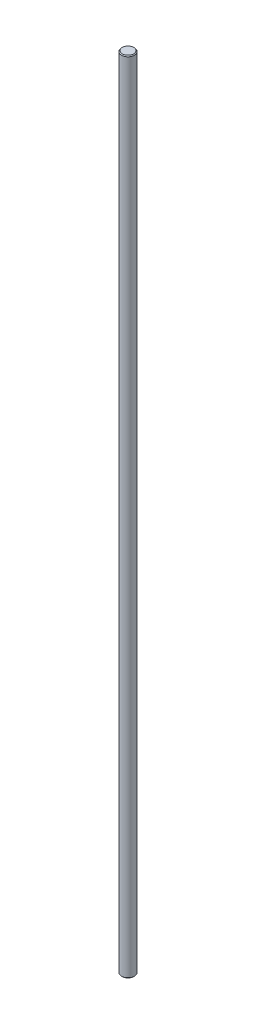
ISO-10303-21;
HEADER;
FILE_DESCRIPTION(('STEP AP214'),'2;1');
FILE_NAME('part.step','',(''),(''),'','','');
FILE_SCHEMA(('AUTOMOTIVE_DESIGN { 1 0 10303 214 1 1 1 1 }'));
ENDSEC;
DATA;
#1=APPLICATION_CONTEXT('core data for automotive mechanical design processes');
#2=APPLICATION_PROTOCOL_DEFINITION('international standard','automotive_design',2000,#1);
#3=PRODUCT_CONTEXT('',#1,'mechanical');
#4=PRODUCT('Part','Part','',(#3));
#5=PRODUCT_RELATED_PRODUCT_CATEGORY('part','',(#4));
#6=PRODUCT_DEFINITION_FORMATION('','',#4);
#7=PRODUCT_DEFINITION_CONTEXT('part definition',#1,'design');
#8=PRODUCT_DEFINITION('design','',#6,#7);
#9=PRODUCT_DEFINITION_SHAPE('','',#8);
#10=(LENGTH_UNIT() NAMED_UNIT(*) SI_UNIT(.MILLI.,.METRE.));
#11=(NAMED_UNIT(*) PLANE_ANGLE_UNIT() SI_UNIT($,.RADIAN.));
#12=(NAMED_UNIT(*) SI_UNIT($,.STERADIAN.) SOLID_ANGLE_UNIT());
#13=UNCERTAINTY_MEASURE_WITH_UNIT(LENGTH_MEASURE(1.E-05),#10,'distance_accuracy_value','');
#14=(GEOMETRIC_REPRESENTATION_CONTEXT(3) GLOBAL_UNCERTAINTY_ASSIGNED_CONTEXT((#13)) GLOBAL_UNIT_ASSIGNED_CONTEXT((#10,
#11,#12)) REPRESENTATION_CONTEXT('',''));
#15=CARTESIAN_POINT('',(0.,0.,0.));
#16=DIRECTION('',(0.,0.,1.));
#17=DIRECTION('',(1.,0.,0.));
#18=AXIS2_PLACEMENT_3D('',#15,#16,#17);
#19=CARTESIAN_POINT('',(0.,494.5,0.));
#20=DIRECTION('',(0.,-1.,0.));
#21=DIRECTION('',(0.,0.,-1.));
#22=AXIS2_PLACEMENT_3D('',#19,#20,#21);
#23=CONICAL_SURFACE('',#22,4.,0.785398163397448);
#24=CARTESIAN_POINT('',(0.,495.,0.));
#25=DIRECTION('',(0.,-1.,0.));
#26=DIRECTION('',(0.,0.,-1.));
#27=AXIS2_PLACEMENT_3D('',#24,#25,#26);
#28=CIRCLE('',#27,3.5);
#29=CARTESIAN_POINT('',(0.,495.,-3.5));
#30=VERTEX_POINT('',#29);
#31=EDGE_CURVE('E42',#30,#30,#28,.T.);
#32=ORIENTED_EDGE('',*,*,#31,.T.);
#33=EDGE_LOOP('',(#32));
#34=FACE_BOUND('',#33,.T.);
#35=CARTESIAN_POINT('',(0.,494.5,0.));
#36=DIRECTION('',(0.,-1.,0.));
#37=DIRECTION('',(0.,0.,-1.));
#38=AXIS2_PLACEMENT_3D('',#35,#36,#37);
#39=CIRCLE('',#38,4.);
#40=CARTESIAN_POINT('',(0.,494.5,-4.));
#41=VERTEX_POINT('',#40);
#42=EDGE_CURVE('E10',#41,#41,#39,.T.);
#43=ORIENTED_EDGE('',*,*,#42,.F.);
#44=EDGE_LOOP('',(#43));
#45=FACE_BOUND('',#44,.T.);
#46=ADVANCED_FACE('F28',(#34,#45),#23,.T.);
#47=CARTESIAN_POINT('',(0.,495.,0.));
#48=DIRECTION('',(0.,-1.,0.));
#49=DIRECTION('',(0.,0.,-1.));
#50=AXIS2_PLACEMENT_3D('',#47,#48,#49);
#51=CYLINDRICAL_SURFACE('',#50,4.);
#52=ORIENTED_EDGE('',*,*,#42,.T.);
#53=EDGE_LOOP('',(#52));
#54=FACE_BOUND('',#53,.T.);
#55=CARTESIAN_POINT('',(0.,0.5,0.));
#56=DIRECTION('',(0.,-1.,0.));
#57=DIRECTION('',(0.,0.,-1.));
#58=AXIS2_PLACEMENT_3D('',#55,#56,#57);
#59=CIRCLE('',#58,4.);
#60=CARTESIAN_POINT('',(0.,0.5,-4.));
#61=VERTEX_POINT('',#60);
#62=EDGE_CURVE('E34',#61,#61,#59,.T.);
#63=ORIENTED_EDGE('',*,*,#62,.F.);
#64=EDGE_LOOP('',(#63));
#65=FACE_BOUND('',#64,.T.);
#66=ADVANCED_FACE('F61',(#54,#65),#51,.T.);
#67=CARTESIAN_POINT('',(0.,0.,0.));
#68=DIRECTION('',(0.,1.,0.));
#69=DIRECTION('',(0.,0.,1.));
#70=AXIS2_PLACEMENT_3D('',#67,#68,#69);
#71=CONICAL_SURFACE('',#70,3.5,0.785398163397448);
#72=ORIENTED_EDGE('',*,*,#62,.T.);
#73=EDGE_LOOP('',(#72));
#74=FACE_BOUND('',#73,.T.);
#75=CARTESIAN_POINT('',(0.,0.,0.));
#76=DIRECTION('',(0.,-1.,0.));
#77=DIRECTION('',(0.,0.,-1.));
#78=AXIS2_PLACEMENT_3D('',#75,#76,#77);
#79=CIRCLE('',#78,3.5);
#80=CARTESIAN_POINT('',(0.,0.,-3.5));
#81=VERTEX_POINT('',#80);
#82=EDGE_CURVE('E38',#81,#81,#79,.T.);
#83=ORIENTED_EDGE('',*,*,#82,.F.);
#84=EDGE_LOOP('',(#83));
#85=FACE_BOUND('',#84,.T.);
#86=ADVANCED_FACE('F57',(#74,#85),#71,.T.);
#87=CARTESIAN_POINT('',(0.,0.,0.));
#88=DIRECTION('',(0.,-1.,0.));
#89=DIRECTION('',(0.,0.,-1.));
#90=AXIS2_PLACEMENT_3D('',#87,#88,#89);
#91=PLANE('',#90);
#92=ORIENTED_EDGE('',*,*,#82,.T.);
#93=EDGE_LOOP('',(#92));
#94=FACE_BOUND('',#93,.T.);
#95=ADVANCED_FACE('F52',(#94),#91,.T.);
#96=CARTESIAN_POINT('',(3.5,495.,0.));
#97=DIRECTION('',(0.,1.,0.));
#98=DIRECTION('',(0.,0.,1.));
#99=AXIS2_PLACEMENT_3D('',#96,#97,#98);
#100=PLANE('',#99);
#101=ORIENTED_EDGE('',*,*,#31,.F.);
#102=EDGE_LOOP('',(#101));
#103=FACE_BOUND('',#102,.T.);
#104=ADVANCED_FACE('F50',(#103),#100,.T.);
#105=CLOSED_SHELL('',(#46,#66,#86,#95,#104));
#106=MANIFOLD_SOLID_BREP('B2',#105);
#107=ADVANCED_BREP_SHAPE_REPRESENTATION('',(#18,#106),#14);
#108=SHAPE_DEFINITION_REPRESENTATION(#9,#107);
ENDSEC;
END-ISO-10303-21;
